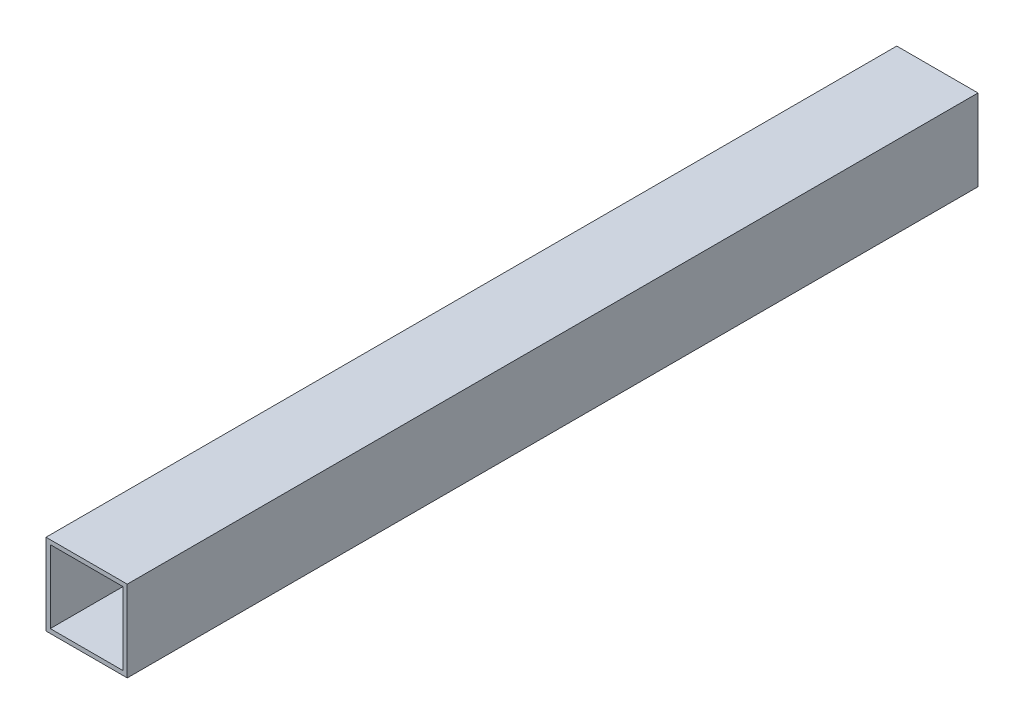
ISO-10303-21;
HEADER;
FILE_DESCRIPTION(('STEP AP214'),'2;1');
FILE_NAME('part.step','',(''),(''),'','','');
FILE_SCHEMA(('AUTOMOTIVE_DESIGN { 1 0 10303 214 1 1 1 1 }'));
ENDSEC;
DATA;
#1=APPLICATION_CONTEXT('core data for automotive mechanical design processes');
#2=APPLICATION_PROTOCOL_DEFINITION('international standard','automotive_design',2000,#1);
#3=PRODUCT_CONTEXT('',#1,'mechanical');
#4=PRODUCT('Part','Part','',(#3));
#5=PRODUCT_RELATED_PRODUCT_CATEGORY('part','',(#4));
#6=PRODUCT_DEFINITION_FORMATION('','',#4);
#7=PRODUCT_DEFINITION_CONTEXT('part definition',#1,'design');
#8=PRODUCT_DEFINITION('design','',#6,#7);
#9=PRODUCT_DEFINITION_SHAPE('','',#8);
#10=(LENGTH_UNIT() NAMED_UNIT(*) SI_UNIT(.MILLI.,.METRE.));
#11=(NAMED_UNIT(*) PLANE_ANGLE_UNIT() SI_UNIT($,.RADIAN.));
#12=(NAMED_UNIT(*) SI_UNIT($,.STERADIAN.) SOLID_ANGLE_UNIT());
#13=UNCERTAINTY_MEASURE_WITH_UNIT(LENGTH_MEASURE(1.E-05),#10,'distance_accuracy_value','');
#14=(GEOMETRIC_REPRESENTATION_CONTEXT(3) GLOBAL_UNCERTAINTY_ASSIGNED_CONTEXT((#13)) GLOBAL_UNIT_ASSIGNED_CONTEXT((#10,
#11,#12)) REPRESENTATION_CONTEXT('',''));
#15=CARTESIAN_POINT('',(0.,0.,0.));
#16=DIRECTION('',(0.,0.,1.));
#17=DIRECTION('',(1.,0.,0.));
#18=AXIS2_PLACEMENT_3D('',#15,#16,#17);
#19=CARTESIAN_POINT('',(0.,0.,200.));
#20=DIRECTION('',(0.,0.,1.));
#21=DIRECTION('',(1.,0.,0.));
#22=AXIS2_PLACEMENT_3D('',#19,#20,#21);
#23=PLANE('',#22);
#24=DIRECTION('',(0.,-1.,0.));
#25=VECTOR('',#24,1.);
#26=CARTESIAN_POINT('',(-16.8238341968912,9.25310880829016,200.));
#27=LINE('',#26,#25);
#28=CARTESIAN_POINT('',(-16.8238341968912,9.25310880829016,200.));
#29=VERTEX_POINT('',#28);
#30=CARTESIAN_POINT('',(-16.8238341968912,-9.84689119170985,200.));
#31=VERTEX_POINT('',#30);
#32=EDGE_CURVE('E133',#29,#31,#27,.T.);
#33=ORIENTED_EDGE('',*,*,#32,.T.);
#34=DIRECTION('',(1.,0.,0.));
#35=VECTOR('',#34,1.);
#36=CARTESIAN_POINT('',(-16.8238341968912,-9.84689119170985,200.));
#37=LINE('',#36,#35);
#38=CARTESIAN_POINT('',(2.27616580310882,-9.84689119170985,200.));
#39=VERTEX_POINT('',#38);
#40=EDGE_CURVE('E136',#31,#39,#37,.T.);
#41=ORIENTED_EDGE('',*,*,#40,.T.);
#42=DIRECTION('',(0.,1.,0.));
#43=VECTOR('',#42,1.);
#44=CARTESIAN_POINT('',(2.27616580310881,9.25310880829016,200.));
#45=LINE('',#44,#43);
#46=CARTESIAN_POINT('',(2.27616580310881,9.25310880829016,200.));
#47=VERTEX_POINT('',#46);
#48=EDGE_CURVE('E139',#39,#47,#45,.T.);
#49=ORIENTED_EDGE('',*,*,#48,.T.);
#50=DIRECTION('',(-1.,0.,0.));
#51=VECTOR('',#50,1.);
#52=CARTESIAN_POINT('',(-16.8238341968912,9.25310880829016,200.));
#53=LINE('',#52,#51);
#54=EDGE_CURVE('E141',#47,#29,#53,.T.);
#55=ORIENTED_EDGE('',*,*,#54,.T.);
#56=EDGE_LOOP('',(#33,#41,#49,#55));
#57=FACE_BOUND('',#56,.T.);
#58=DIRECTION('',(1.,0.,0.));
#59=VECTOR('',#58,1.);
#60=CARTESIAN_POINT('',(-15.8238341968912,-8.84689119170985,200.));
#61=LINE('',#60,#59);
#62=CARTESIAN_POINT('',(-15.8238341968912,-8.84689119170985,200.));
#63=VERTEX_POINT('',#62);
#64=CARTESIAN_POINT('',(1.27616580310881,-8.84689119170985,200.));
#65=VERTEX_POINT('',#64);
#66=EDGE_CURVE('E105',#63,#65,#61,.T.);
#67=ORIENTED_EDGE('',*,*,#66,.F.);
#68=DIRECTION('',(0.,-1.,0.));
#69=VECTOR('',#68,1.);
#70=CARTESIAN_POINT('',(-15.8238341968912,8.25310880829016,200.));
#71=LINE('',#70,#69);
#72=CARTESIAN_POINT('',(-15.8238341968912,8.25310880829016,200.));
#73=VERTEX_POINT('',#72);
#74=EDGE_CURVE('E97',#73,#63,#71,.T.);
#75=ORIENTED_EDGE('',*,*,#74,.F.);
#76=DIRECTION('',(-1.,0.,0.));
#77=VECTOR('',#76,1.);
#78=CARTESIAN_POINT('',(-15.8238341968912,8.25310880829016,200.));
#79=LINE('',#78,#77);
#80=CARTESIAN_POINT('',(1.27616580310881,8.25310880829016,200.));
#81=VERTEX_POINT('',#80);
#82=EDGE_CURVE('E119',#81,#73,#79,.T.);
#83=ORIENTED_EDGE('',*,*,#82,.F.);
#84=DIRECTION('',(0.,1.,0.));
#85=VECTOR('',#84,1.);
#86=CARTESIAN_POINT('',(1.27616580310881,8.25310880829016,200.));
#87=LINE('',#86,#85);
#88=EDGE_CURVE('E117',#65,#81,#87,.T.);
#89=ORIENTED_EDGE('',*,*,#88,.F.);
#90=EDGE_LOOP('',(#67,#75,#83,#89));
#91=FACE_BOUND('',#90,.T.);
#92=ADVANCED_FACE('F32',(#57,#91),#23,.T.);
#93=CARTESIAN_POINT('',(0.,0.,0.));
#94=DIRECTION('',(0.,0.,1.));
#95=DIRECTION('',(1.,0.,0.));
#96=AXIS2_PLACEMENT_3D('',#93,#94,#95);
#97=PLANE('',#96);
#98=DIRECTION('',(0.,-1.,0.));
#99=VECTOR('',#98,1.);
#100=CARTESIAN_POINT('',(-16.8238341968912,9.25310880829016,0.));
#101=LINE('',#100,#99);
#102=CARTESIAN_POINT('',(-16.8238341968912,9.25310880829016,0.));
#103=VERTEX_POINT('',#102);
#104=CARTESIAN_POINT('',(-16.8238341968912,-9.84689119170985,0.));
#105=VERTEX_POINT('',#104);
#106=EDGE_CURVE('E113',#103,#105,#101,.T.);
#107=ORIENTED_EDGE('',*,*,#106,.F.);
#108=DIRECTION('',(-1.,0.,0.));
#109=VECTOR('',#108,1.);
#110=CARTESIAN_POINT('',(-16.8238341968912,9.25310880829016,0.));
#111=LINE('',#110,#109);
#112=CARTESIAN_POINT('',(2.27616580310881,9.25310880829016,0.));
#113=VERTEX_POINT('',#112);
#114=EDGE_CURVE('E137',#113,#103,#111,.T.);
#115=ORIENTED_EDGE('',*,*,#114,.F.);
#116=DIRECTION('',(0.,1.,0.));
#117=VECTOR('',#116,1.);
#118=CARTESIAN_POINT('',(2.27616580310881,9.25310880829016,0.));
#119=LINE('',#118,#117);
#120=CARTESIAN_POINT('',(2.27616580310882,-9.84689119170985,0.));
#121=VERTEX_POINT('',#120);
#122=EDGE_CURVE('E148',#121,#113,#119,.T.);
#123=ORIENTED_EDGE('',*,*,#122,.F.);
#124=DIRECTION('',(1.,0.,0.));
#125=VECTOR('',#124,1.);
#126=CARTESIAN_POINT('',(-16.8238341968912,-9.84689119170985,0.));
#127=LINE('',#126,#125);
#128=EDGE_CURVE('E146',#105,#121,#127,.T.);
#129=ORIENTED_EDGE('',*,*,#128,.F.);
#130=EDGE_LOOP('',(#107,#115,#123,#129));
#131=FACE_BOUND('',#130,.T.);
#132=DIRECTION('',(0.,-1.,0.));
#133=VECTOR('',#132,1.);
#134=CARTESIAN_POINT('',(-15.8238341968912,8.25310880829016,0.));
#135=LINE('',#134,#133);
#136=CARTESIAN_POINT('',(-15.8238341968912,8.25310880829016,0.));
#137=VERTEX_POINT('',#136);
#138=CARTESIAN_POINT('',(-15.8238341968912,-8.84689119170985,0.));
#139=VERTEX_POINT('',#138);
#140=EDGE_CURVE('E55',#137,#139,#135,.T.);
#141=ORIENTED_EDGE('',*,*,#140,.T.);
#142=DIRECTION('',(1.,0.,0.));
#143=VECTOR('',#142,1.);
#144=CARTESIAN_POINT('',(-15.8238341968912,-8.84689119170985,0.));
#145=LINE('',#144,#143);
#146=CARTESIAN_POINT('',(1.27616580310881,-8.84689119170985,0.));
#147=VERTEX_POINT('',#146);
#148=EDGE_CURVE('E112',#139,#147,#145,.T.);
#149=ORIENTED_EDGE('',*,*,#148,.T.);
#150=DIRECTION('',(0.,1.,0.));
#151=VECTOR('',#150,1.);
#152=CARTESIAN_POINT('',(1.27616580310881,8.25310880829016,0.));
#153=LINE('',#152,#151);
#154=CARTESIAN_POINT('',(1.27616580310881,8.25310880829016,0.));
#155=VERTEX_POINT('',#154);
#156=EDGE_CURVE('E125',#147,#155,#153,.T.);
#157=ORIENTED_EDGE('',*,*,#156,.T.);
#158=DIRECTION('',(-1.,0.,0.));
#159=VECTOR('',#158,1.);
#160=CARTESIAN_POINT('',(-15.8238341968912,8.25310880829016,0.));
#161=LINE('',#160,#159);
#162=EDGE_CURVE('E106',#155,#137,#161,.T.);
#163=ORIENTED_EDGE('',*,*,#162,.T.);
#164=EDGE_LOOP('',(#141,#149,#157,#163));
#165=FACE_BOUND('',#164,.T.);
#166=ADVANCED_FACE('F166',(#131,#165),#97,.F.);
#167=CARTESIAN_POINT('',(-16.8238341968912,9.25310880829016,200.));
#168=DIRECTION('',(1.,0.,0.));
#169=DIRECTION('',(0.,0.,-1.));
#170=AXIS2_PLACEMENT_3D('',#167,#168,#169);
#171=PLANE('',#170);
#172=ORIENTED_EDGE('',*,*,#106,.T.);
#173=DIRECTION('',(0.,0.,-1.));
#174=VECTOR('',#173,1.);
#175=CARTESIAN_POINT('',(-16.8238341968912,-9.84689119170985,200.));
#176=LINE('',#175,#174);
#177=EDGE_CURVE('E11',#31,#105,#176,.T.);
#178=ORIENTED_EDGE('',*,*,#177,.F.);
#179=ORIENTED_EDGE('',*,*,#32,.F.);
#180=DIRECTION('',(0.,0.,-1.));
#181=VECTOR('',#180,1.);
#182=CARTESIAN_POINT('',(-16.8238341968912,9.25310880829016,200.));
#183=LINE('',#182,#181);
#184=EDGE_CURVE('E143',#29,#103,#183,.T.);
#185=ORIENTED_EDGE('',*,*,#184,.T.);
#186=EDGE_LOOP('',(#172,#178,#179,#185));
#187=FACE_BOUND('',#186,.T.);
#188=ADVANCED_FACE('F34',(#187),#171,.F.);
#189=CARTESIAN_POINT('',(-16.8238341968912,-9.84689119170985,200.));
#190=DIRECTION('',(0.,1.,0.));
#191=DIRECTION('',(0.,0.,1.));
#192=AXIS2_PLACEMENT_3D('',#189,#190,#191);
#193=PLANE('',#192);
#194=ORIENTED_EDGE('',*,*,#128,.T.);
#195=DIRECTION('',(0.,0.,-1.));
#196=VECTOR('',#195,1.);
#197=CARTESIAN_POINT('',(2.27616580310882,-9.84689119170985,200.));
#198=LINE('',#197,#196);
#199=EDGE_CURVE('E40',#39,#121,#198,.T.);
#200=ORIENTED_EDGE('',*,*,#199,.F.);
#201=ORIENTED_EDGE('',*,*,#40,.F.);
#202=ORIENTED_EDGE('',*,*,#177,.T.);
#203=EDGE_LOOP('',(#194,#200,#201,#202));
#204=FACE_BOUND('',#203,.T.);
#205=ADVANCED_FACE('F176',(#204),#193,.F.);
#206=CARTESIAN_POINT('',(2.27616580310881,9.25310880829016,200.));
#207=DIRECTION('',(-1.,0.,0.));
#208=DIRECTION('',(0.,-1.,0.));
#209=AXIS2_PLACEMENT_3D('',#206,#207,#208);
#210=PLANE('',#209);
#211=ORIENTED_EDGE('',*,*,#122,.T.);
#212=DIRECTION('',(0.,0.,-1.));
#213=VECTOR('',#212,1.);
#214=CARTESIAN_POINT('',(2.27616580310881,9.25310880829016,200.));
#215=LINE('',#214,#213);
#216=EDGE_CURVE('E153',#47,#113,#215,.T.);
#217=ORIENTED_EDGE('',*,*,#216,.F.);
#218=ORIENTED_EDGE('',*,*,#48,.F.);
#219=ORIENTED_EDGE('',*,*,#199,.T.);
#220=EDGE_LOOP('',(#211,#217,#218,#219));
#221=FACE_BOUND('',#220,.T.);
#222=ADVANCED_FACE('F160',(#221),#210,.F.);
#223=CARTESIAN_POINT('',(-16.8238341968912,9.25310880829016,200.));
#224=DIRECTION('',(0.,-1.,0.));
#225=DIRECTION('',(0.,0.,-1.));
#226=AXIS2_PLACEMENT_3D('',#223,#224,#225);
#227=PLANE('',#226);
#228=ORIENTED_EDGE('',*,*,#114,.T.);
#229=ORIENTED_EDGE('',*,*,#184,.F.);
#230=ORIENTED_EDGE('',*,*,#54,.F.);
#231=ORIENTED_EDGE('',*,*,#216,.T.);
#232=EDGE_LOOP('',(#228,#229,#230,#231));
#233=FACE_BOUND('',#232,.T.);
#234=ADVANCED_FACE('F170',(#233),#227,.F.);
#235=CARTESIAN_POINT('',(-15.8238341968912,8.25310880829016,200.));
#236=DIRECTION('',(1.,0.,0.));
#237=DIRECTION('',(0.,0.,-1.));
#238=AXIS2_PLACEMENT_3D('',#235,#236,#237);
#239=PLANE('',#238);
#240=ORIENTED_EDGE('',*,*,#140,.F.);
#241=DIRECTION('',(0.,0.,-1.));
#242=VECTOR('',#241,1.);
#243=CARTESIAN_POINT('',(-15.8238341968912,8.25310880829016,200.));
#244=LINE('',#243,#242);
#245=EDGE_CURVE('E101',#73,#137,#244,.T.);
#246=ORIENTED_EDGE('',*,*,#245,.F.);
#247=ORIENTED_EDGE('',*,*,#74,.T.);
#248=DIRECTION('',(0.,0.,-1.));
#249=VECTOR('',#248,1.);
#250=CARTESIAN_POINT('',(-15.8238341968912,-8.84689119170985,200.));
#251=LINE('',#250,#249);
#252=EDGE_CURVE('E100',#63,#139,#251,.T.);
#253=ORIENTED_EDGE('',*,*,#252,.T.);
#254=EDGE_LOOP('',(#240,#246,#247,#253));
#255=FACE_BOUND('',#254,.T.);
#256=ADVANCED_FACE('F99',(#255),#239,.T.);
#257=CARTESIAN_POINT('',(-15.8238341968912,-8.84689119170985,200.));
#258=DIRECTION('',(0.,1.,0.));
#259=DIRECTION('',(0.,0.,1.));
#260=AXIS2_PLACEMENT_3D('',#257,#258,#259);
#261=PLANE('',#260);
#262=ORIENTED_EDGE('',*,*,#148,.F.);
#263=ORIENTED_EDGE('',*,*,#252,.F.);
#264=ORIENTED_EDGE('',*,*,#66,.T.);
#265=DIRECTION('',(0.,0.,-1.));
#266=VECTOR('',#265,1.);
#267=CARTESIAN_POINT('',(1.27616580310881,-8.84689119170985,200.));
#268=LINE('',#267,#266);
#269=EDGE_CURVE('E114',#65,#147,#268,.T.);
#270=ORIENTED_EDGE('',*,*,#269,.T.);
#271=EDGE_LOOP('',(#262,#263,#264,#270));
#272=FACE_BOUND('',#271,.T.);
#273=ADVANCED_FACE('F109',(#272),#261,.T.);
#274=CARTESIAN_POINT('',(1.27616580310881,8.25310880829016,200.));
#275=DIRECTION('',(-1.,0.,0.));
#276=DIRECTION('',(0.,-1.,0.));
#277=AXIS2_PLACEMENT_3D('',#274,#275,#276);
#278=PLANE('',#277);
#279=ORIENTED_EDGE('',*,*,#156,.F.);
#280=ORIENTED_EDGE('',*,*,#269,.F.);
#281=ORIENTED_EDGE('',*,*,#88,.T.);
#282=DIRECTION('',(0.,0.,-1.));
#283=VECTOR('',#282,1.);
#284=CARTESIAN_POINT('',(1.27616580310881,8.25310880829016,200.));
#285=LINE('',#284,#283);
#286=EDGE_CURVE('E47',#81,#155,#285,.T.);
#287=ORIENTED_EDGE('',*,*,#286,.T.);
#288=EDGE_LOOP('',(#279,#280,#281,#287));
#289=FACE_BOUND('',#288,.T.);
#290=ADVANCED_FACE('F199',(#289),#278,.T.);
#291=CARTESIAN_POINT('',(-15.8238341968912,8.25310880829016,200.));
#292=DIRECTION('',(0.,-1.,0.));
#293=DIRECTION('',(0.,0.,-1.));
#294=AXIS2_PLACEMENT_3D('',#291,#292,#293);
#295=PLANE('',#294);
#296=ORIENTED_EDGE('',*,*,#162,.F.);
#297=ORIENTED_EDGE('',*,*,#286,.F.);
#298=ORIENTED_EDGE('',*,*,#82,.T.);
#299=ORIENTED_EDGE('',*,*,#245,.T.);
#300=EDGE_LOOP('',(#296,#297,#298,#299));
#301=FACE_BOUND('',#300,.T.);
#302=ADVANCED_FACE('F203',(#301),#295,.T.);
#303=CLOSED_SHELL('',(#92,#166,#188,#205,#222,#234,#256,#273,#290,#302));
#304=MANIFOLD_SOLID_BREP('B2',#303);
#305=ADVANCED_BREP_SHAPE_REPRESENTATION('',(#18,#304),#14);
#306=SHAPE_DEFINITION_REPRESENTATION(#9,#305);
ENDSEC;
END-ISO-10303-21;
